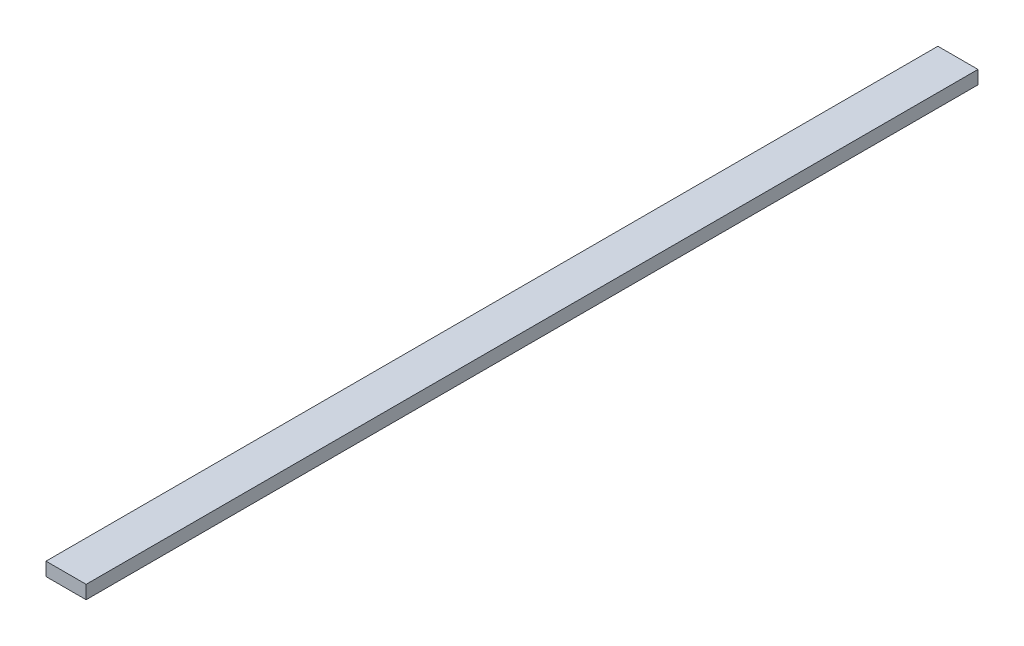
ISO-10303-21;
HEADER;
FILE_DESCRIPTION(('STEP AP214'),'2;1');
FILE_NAME('part.step','',(''),(''),'','','');
FILE_SCHEMA(('AUTOMOTIVE_DESIGN { 1 0 10303 214 1 1 1 1 }'));
ENDSEC;
DATA;
#1=APPLICATION_CONTEXT('core data for automotive mechanical design processes');
#2=APPLICATION_PROTOCOL_DEFINITION('international standard','automotive_design',2000,#1);
#3=PRODUCT_CONTEXT('',#1,'mechanical');
#4=PRODUCT('Part','Part','',(#3));
#5=PRODUCT_RELATED_PRODUCT_CATEGORY('part','',(#4));
#6=PRODUCT_DEFINITION_FORMATION('','',#4);
#7=PRODUCT_DEFINITION_CONTEXT('part definition',#1,'design');
#8=PRODUCT_DEFINITION('design','',#6,#7);
#9=PRODUCT_DEFINITION_SHAPE('','',#8);
#10=(LENGTH_UNIT() NAMED_UNIT(*) SI_UNIT(.MILLI.,.METRE.));
#11=(NAMED_UNIT(*) PLANE_ANGLE_UNIT() SI_UNIT($,.RADIAN.));
#12=(NAMED_UNIT(*) SI_UNIT($,.STERADIAN.) SOLID_ANGLE_UNIT());
#13=UNCERTAINTY_MEASURE_WITH_UNIT(LENGTH_MEASURE(1.E-05),#10,'distance_accuracy_value','');
#14=(GEOMETRIC_REPRESENTATION_CONTEXT(3) GLOBAL_UNCERTAINTY_ASSIGNED_CONTEXT((#13)) GLOBAL_UNIT_ASSIGNED_CONTEXT((#10,
#11,#12)) REPRESENTATION_CONTEXT('',''));
#15=CARTESIAN_POINT('',(0.,0.,0.));
#16=DIRECTION('',(0.,0.,1.));
#17=DIRECTION('',(1.,0.,0.));
#18=AXIS2_PLACEMENT_3D('',#15,#16,#17);
#19=CARTESIAN_POINT('',(0.,0.,100.));
#20=DIRECTION('',(1.,0.,0.));
#21=DIRECTION('',(0.,1.,0.));
#22=AXIS2_PLACEMENT_3D('',#19,#20,#21);
#23=PLANE('',#22);
#24=DIRECTION('',(0.,-1.,0.));
#25=VECTOR('',#24,1.);
#26=CARTESIAN_POINT('',(0.,0.,0.));
#27=LINE('',#26,#25);
#28=CARTESIAN_POINT('',(0.,1.5,0.));
#29=VERTEX_POINT('',#28);
#30=CARTESIAN_POINT('',(0.,0.,0.));
#31=VERTEX_POINT('',#30);
#32=EDGE_CURVE('E107',#29,#31,#27,.T.);
#33=ORIENTED_EDGE('',*,*,#32,.T.);
#34=DIRECTION('',(0.,0.,-1.));
#35=VECTOR('',#34,1.);
#36=CARTESIAN_POINT('',(0.,0.,100.));
#37=LINE('',#36,#35);
#38=CARTESIAN_POINT('',(0.,0.,100.));
#39=VERTEX_POINT('',#38);
#40=EDGE_CURVE('E11',#39,#31,#37,.T.);
#41=ORIENTED_EDGE('',*,*,#40,.F.);
#42=DIRECTION('',(0.,-1.,0.));
#43=VECTOR('',#42,1.);
#44=CARTESIAN_POINT('',(0.,0.,100.));
#45=LINE('',#44,#43);
#46=CARTESIAN_POINT('',(0.,1.5,100.));
#47=VERTEX_POINT('',#46);
#48=EDGE_CURVE('E91',#47,#39,#45,.T.);
#49=ORIENTED_EDGE('',*,*,#48,.F.);
#50=DIRECTION('',(0.,0.,-1.));
#51=VECTOR('',#50,1.);
#52=CARTESIAN_POINT('',(0.,1.5,100.));
#53=LINE('',#52,#51);
#54=EDGE_CURVE('E103',#47,#29,#53,.T.);
#55=ORIENTED_EDGE('',*,*,#54,.T.);
#56=EDGE_LOOP('',(#33,#41,#49,#55));
#57=FACE_BOUND('',#56,.T.);
#58=ADVANCED_FACE('F39',(#57),#23,.F.);
#59=CARTESIAN_POINT('',(0.,0.,100.));
#60=DIRECTION('',(0.,1.,0.));
#61=DIRECTION('',(0.,0.,1.));
#62=AXIS2_PLACEMENT_3D('',#59,#60,#61);
#63=PLANE('',#62);
#64=DIRECTION('',(1.,0.,0.));
#65=VECTOR('',#64,1.);
#66=CARTESIAN_POINT('',(0.,0.,0.));
#67=LINE('',#66,#65);
#68=CARTESIAN_POINT('',(4.5,0.,0.));
#69=VERTEX_POINT('',#68);
#70=EDGE_CURVE('E96',#31,#69,#67,.T.);
#71=ORIENTED_EDGE('',*,*,#70,.T.);
#72=DIRECTION('',(0.,0.,-1.));
#73=VECTOR('',#72,1.);
#74=CARTESIAN_POINT('',(4.5,0.,100.));
#75=LINE('',#74,#73);
#76=CARTESIAN_POINT('',(4.5,0.,100.));
#77=VERTEX_POINT('',#76);
#78=EDGE_CURVE('E48',#77,#69,#75,.T.);
#79=ORIENTED_EDGE('',*,*,#78,.F.);
#80=DIRECTION('',(1.,0.,0.));
#81=VECTOR('',#80,1.);
#82=CARTESIAN_POINT('',(0.,0.,100.));
#83=LINE('',#82,#81);
#84=EDGE_CURVE('E86',#39,#77,#83,.T.);
#85=ORIENTED_EDGE('',*,*,#84,.F.);
#86=ORIENTED_EDGE('',*,*,#40,.T.);
#87=EDGE_LOOP('',(#71,#79,#85,#86));
#88=FACE_BOUND('',#87,.T.);
#89=ADVANCED_FACE('F95',(#88),#63,.F.);
#90=CARTESIAN_POINT('',(4.5,0.,100.));
#91=DIRECTION('',(-1.,0.,0.));
#92=DIRECTION('',(0.,-1.,0.));
#93=AXIS2_PLACEMENT_3D('',#90,#91,#92);
#94=PLANE('',#93);
#95=DIRECTION('',(0.,1.,0.));
#96=VECTOR('',#95,1.);
#97=CARTESIAN_POINT('',(4.5,0.,0.));
#98=LINE('',#97,#96);
#99=CARTESIAN_POINT('',(4.5,1.5,0.));
#100=VERTEX_POINT('',#99);
#101=EDGE_CURVE('E73',#69,#100,#98,.T.);
#102=ORIENTED_EDGE('',*,*,#101,.T.);
#103=DIRECTION('',(0.,0.,-1.));
#104=VECTOR('',#103,1.);
#105=CARTESIAN_POINT('',(4.5,1.5,100.));
#106=LINE('',#105,#104);
#107=CARTESIAN_POINT('',(4.5,1.5,100.));
#108=VERTEX_POINT('',#107);
#109=EDGE_CURVE('E98',#108,#100,#106,.T.);
#110=ORIENTED_EDGE('',*,*,#109,.F.);
#111=DIRECTION('',(0.,1.,0.));
#112=VECTOR('',#111,1.);
#113=CARTESIAN_POINT('',(4.5,0.,100.));
#114=LINE('',#113,#112);
#115=EDGE_CURVE('E89',#77,#108,#114,.T.);
#116=ORIENTED_EDGE('',*,*,#115,.F.);
#117=ORIENTED_EDGE('',*,*,#78,.T.);
#118=EDGE_LOOP('',(#102,#110,#116,#117));
#119=FACE_BOUND('',#118,.T.);
#120=ADVANCED_FACE('F99',(#119),#94,.F.);
#121=CARTESIAN_POINT('',(0.,1.5,100.));
#122=DIRECTION('',(0.,-1.,0.));
#123=DIRECTION('',(0.,0.,-1.));
#124=AXIS2_PLACEMENT_3D('',#121,#122,#123);
#125=PLANE('',#124);
#126=DIRECTION('',(-1.,0.,0.));
#127=VECTOR('',#126,1.);
#128=CARTESIAN_POINT('',(0.,1.5,0.));
#129=LINE('',#128,#127);
#130=EDGE_CURVE('E79',#100,#29,#129,.T.);
#131=ORIENTED_EDGE('',*,*,#130,.T.);
#132=ORIENTED_EDGE('',*,*,#54,.F.);
#133=DIRECTION('',(-1.,0.,0.));
#134=VECTOR('',#133,1.);
#135=CARTESIAN_POINT('',(0.,1.5,100.));
#136=LINE('',#135,#134);
#137=EDGE_CURVE('E56',#108,#47,#136,.T.);
#138=ORIENTED_EDGE('',*,*,#137,.F.);
#139=ORIENTED_EDGE('',*,*,#109,.T.);
#140=EDGE_LOOP('',(#131,#132,#138,#139));
#141=FACE_BOUND('',#140,.T.);
#142=ADVANCED_FACE('F120',(#141),#125,.F.);
#143=CARTESIAN_POINT('',(0.,0.,100.));
#144=DIRECTION('',(0.,0.,-1.));
#145=DIRECTION('',(-1.,0.,0.));
#146=AXIS2_PLACEMENT_3D('',#143,#144,#145);
#147=PLANE('',#146);
#148=ORIENTED_EDGE('',*,*,#48,.T.);
#149=ORIENTED_EDGE('',*,*,#84,.T.);
#150=ORIENTED_EDGE('',*,*,#115,.T.);
#151=ORIENTED_EDGE('',*,*,#137,.T.);
#152=EDGE_LOOP('',(#148,#149,#150,#151));
#153=FACE_BOUND('',#152,.T.);
#154=ADVANCED_FACE('F87',(#153),#147,.F.);
#155=CARTESIAN_POINT('',(0.,0.,0.));
#156=DIRECTION('',(0.,0.,-1.));
#157=DIRECTION('',(-1.,0.,0.));
#158=AXIS2_PLACEMENT_3D('',#155,#156,#157);
#159=PLANE('',#158);
#160=ORIENTED_EDGE('',*,*,#32,.F.);
#161=ORIENTED_EDGE('',*,*,#130,.F.);
#162=ORIENTED_EDGE('',*,*,#101,.F.);
#163=ORIENTED_EDGE('',*,*,#70,.F.);
#164=EDGE_LOOP('',(#160,#161,#162,#163));
#165=FACE_BOUND('',#164,.T.);
#166=ADVANCED_FACE('F123',(#165),#159,.T.);
#167=CLOSED_SHELL('',(#58,#89,#120,#142,#154,#166));
#168=MANIFOLD_SOLID_BREP('B2',#167);
#169=ADVANCED_BREP_SHAPE_REPRESENTATION('',(#18,#168),#14);
#170=SHAPE_DEFINITION_REPRESENTATION(#9,#169);
ENDSEC;
END-ISO-10303-21;
